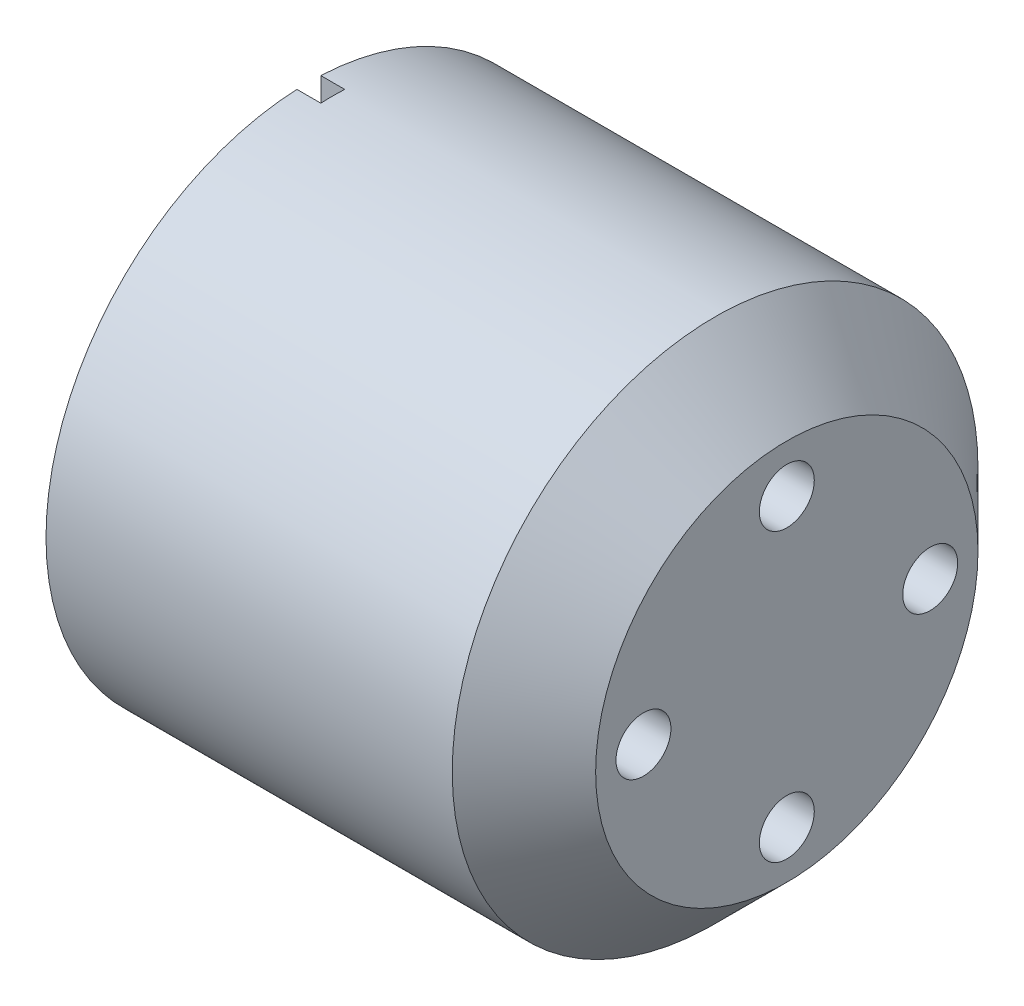
ISO-10303-21;
HEADER;
FILE_DESCRIPTION(('STEP AP214'),'2;1');
FILE_NAME('part.step','',(''),(''),'','','');
FILE_SCHEMA(('AUTOMOTIVE_DESIGN { 1 0 10303 214 1 1 1 1 }'));
ENDSEC;
DATA;
#1=APPLICATION_CONTEXT('core data for automotive mechanical design processes');
#2=APPLICATION_PROTOCOL_DEFINITION('international standard','automotive_design',2000,#1);
#3=PRODUCT_CONTEXT('',#1,'mechanical');
#4=PRODUCT('Part','Part','',(#3));
#5=PRODUCT_RELATED_PRODUCT_CATEGORY('part','',(#4));
#6=PRODUCT_DEFINITION_FORMATION('','',#4);
#7=PRODUCT_DEFINITION_CONTEXT('part definition',#1,'design');
#8=PRODUCT_DEFINITION('design','',#6,#7);
#9=PRODUCT_DEFINITION_SHAPE('','',#8);
#10=(LENGTH_UNIT() NAMED_UNIT(*) SI_UNIT(.MILLI.,.METRE.));
#11=(NAMED_UNIT(*) PLANE_ANGLE_UNIT() SI_UNIT($,.RADIAN.));
#12=(NAMED_UNIT(*) SI_UNIT($,.STERADIAN.) SOLID_ANGLE_UNIT());
#13=UNCERTAINTY_MEASURE_WITH_UNIT(LENGTH_MEASURE(1.E-05),#10,'distance_accuracy_value','');
#14=(GEOMETRIC_REPRESENTATION_CONTEXT(3) GLOBAL_UNCERTAINTY_ASSIGNED_CONTEXT((#13)) GLOBAL_UNIT_ASSIGNED_CONTEXT((#10,
#11,#12)) REPRESENTATION_CONTEXT('',''));
#15=CARTESIAN_POINT('',(0.,0.,0.));
#16=DIRECTION('',(0.,0.,1.));
#17=DIRECTION('',(1.,0.,0.));
#18=AXIS2_PLACEMENT_3D('',#15,#16,#17);
#19=CARTESIAN_POINT('',(20.,0.,0.));
#20=DIRECTION('',(1.,0.,0.));
#21=DIRECTION('',(0.,0.,-1.));
#22=AXIS2_PLACEMENT_3D('',#19,#20,#21);
#23=PLANE('',#22);
#24=CARTESIAN_POINT('',(20.,0.,0.));
#25=DIRECTION('',(1.,0.,0.));
#26=DIRECTION('',(0.,0.,-1.));
#27=AXIS2_PLACEMENT_3D('',#24,#25,#26);
#28=CIRCLE('',#27,7.99999999999999);
#29=CARTESIAN_POINT('',(20.,0.,-7.99999999999999));
#30=VERTEX_POINT('',#29);
#31=EDGE_CURVE('E156',#30,#30,#28,.T.);
#32=ORIENTED_EDGE('',*,*,#31,.T.);
#33=EDGE_LOOP('',(#32));
#34=FACE_BOUND('',#33,.T.);
#35=CARTESIAN_POINT('',(20.,-6.,0.));
#36=DIRECTION('',(1.,0.,0.));
#37=DIRECTION('',(0.,0.,-1.));
#38=AXIS2_PLACEMENT_3D('',#35,#36,#37);
#39=CIRCLE('',#38,1.15);
#40=CARTESIAN_POINT('',(20.,-6.,-1.15));
#41=VERTEX_POINT('',#40);
#42=EDGE_CURVE('E143',#41,#41,#39,.T.);
#43=ORIENTED_EDGE('',*,*,#42,.F.);
#44=EDGE_LOOP('',(#43));
#45=FACE_BOUND('',#44,.T.);
#46=CARTESIAN_POINT('',(20.,6.,0.));
#47=DIRECTION('',(1.,0.,0.));
#48=DIRECTION('',(0.,0.,-1.));
#49=AXIS2_PLACEMENT_3D('',#46,#47,#48);
#50=CIRCLE('',#49,1.15);
#51=CARTESIAN_POINT('',(20.,6.,-1.15));
#52=VERTEX_POINT('',#51);
#53=EDGE_CURVE('E150',#52,#52,#50,.T.);
#54=ORIENTED_EDGE('',*,*,#53,.F.);
#55=EDGE_LOOP('',(#54));
#56=FACE_BOUND('',#55,.T.);
#57=CARTESIAN_POINT('',(20.,0.,6.));
#58=DIRECTION('',(1.,0.,0.));
#59=DIRECTION('',(0.,0.,-1.));
#60=AXIS2_PLACEMENT_3D('',#57,#58,#59);
#61=CIRCLE('',#60,1.15);
#62=CARTESIAN_POINT('',(20.,0.,4.85));
#63=VERTEX_POINT('',#62);
#64=EDGE_CURVE('E147',#63,#63,#61,.T.);
#65=ORIENTED_EDGE('',*,*,#64,.F.);
#66=EDGE_LOOP('',(#65));
#67=FACE_BOUND('',#66,.T.);
#68=CARTESIAN_POINT('',(20.,0.,-6.));
#69=DIRECTION('',(1.,0.,0.));
#70=DIRECTION('',(0.,0.,-1.));
#71=AXIS2_PLACEMENT_3D('',#68,#69,#70);
#72=CIRCLE('',#71,1.15);
#73=CARTESIAN_POINT('',(20.,0.,-7.15));
#74=VERTEX_POINT('',#73);
#75=EDGE_CURVE('E140',#74,#74,#72,.T.);
#76=ORIENTED_EDGE('',*,*,#75,.F.);
#77=EDGE_LOOP('',(#76));
#78=FACE_BOUND('',#77,.T.);
#79=ADVANCED_FACE('F36',(#34,#45,#56,#67,#78),#23,.T.);
#80=CARTESIAN_POINT('',(0.,0.,0.));
#81=DIRECTION('',(1.,0.,0.));
#82=DIRECTION('',(0.,0.,-1.));
#83=AXIS2_PLACEMENT_3D('',#80,#81,#82);
#84=PLANE('',#83);
#85=CARTESIAN_POINT('',(0.,-5.30330085889914,-5.30330085889908));
#86=DIRECTION('',(1.,0.,0.));
#87=DIRECTION('',(0.,0.,-1.));
#88=AXIS2_PLACEMENT_3D('',#85,#86,#87);
#89=CIRCLE('',#88,2.30000000000001);
#90=CARTESIAN_POINT('',(0.,-5.30330085889914,-7.60330085889908));
#91=VERTEX_POINT('',#90);
#92=EDGE_CURVE('E184',#91,#91,#89,.T.);
#93=ORIENTED_EDGE('',*,*,#92,.T.);
#94=EDGE_LOOP('',(#93));
#95=FACE_BOUND('',#94,.T.);
#96=CARTESIAN_POINT('',(0.,-5.30330085889907,5.30330085889914));
#97=DIRECTION('',(1.,0.,0.));
#98=DIRECTION('',(0.,0.,-1.));
#99=AXIS2_PLACEMENT_3D('',#96,#97,#98);
#100=CIRCLE('',#99,2.30000000000001);
#101=CARTESIAN_POINT('',(0.,-5.30330085889907,3.00330085889913));
#102=VERTEX_POINT('',#101);
#103=EDGE_CURVE('E181',#102,#102,#100,.T.);
#104=ORIENTED_EDGE('',*,*,#103,.T.);
#105=EDGE_LOOP('',(#104));
#106=FACE_BOUND('',#105,.T.);
#107=CARTESIAN_POINT('',(0.,5.30330085889914,5.30330085889908));
#108=DIRECTION('',(1.,0.,0.));
#109=DIRECTION('',(0.,0.,-1.));
#110=AXIS2_PLACEMENT_3D('',#107,#108,#109);
#111=CIRCLE('',#110,2.30000000000001);
#112=CARTESIAN_POINT('',(0.,5.30330085889914,3.00330085889907));
#113=VERTEX_POINT('',#112);
#114=EDGE_CURVE('E178',#113,#113,#111,.T.);
#115=ORIENTED_EDGE('',*,*,#114,.T.);
#116=EDGE_LOOP('',(#115));
#117=FACE_BOUND('',#116,.T.);
#118=CARTESIAN_POINT('',(0.,5.30330085889908,-5.30330085889914));
#119=DIRECTION('',(1.,0.,0.));
#120=DIRECTION('',(0.,0.,-1.));
#121=AXIS2_PLACEMENT_3D('',#118,#119,#120);
#122=CIRCLE('',#121,2.30000000000001);
#123=CARTESIAN_POINT('',(0.,5.30330085889908,-7.60330085889914));
#124=VERTEX_POINT('',#123);
#125=EDGE_CURVE('E175',#124,#124,#122,.T.);
#126=ORIENTED_EDGE('',*,*,#125,.T.);
#127=EDGE_LOOP('',(#126));
#128=FACE_BOUND('',#127,.T.);
#129=CARTESIAN_POINT('',(0.,0.,-6.));
#130=DIRECTION('',(-1.,0.,0.));
#131=DIRECTION('',(0.,0.,1.));
#132=AXIS2_PLACEMENT_3D('',#129,#130,#131);
#133=CIRCLE('',#132,2.);
#134=CARTESIAN_POINT('',(0.,0.,-4.));
#135=VERTEX_POINT('',#134);
#136=EDGE_CURVE('E116',#135,#135,#133,.T.);
#137=ORIENTED_EDGE('',*,*,#136,.F.);
#138=EDGE_LOOP('',(#137));
#139=FACE_BOUND('',#138,.T.);
#140=CARTESIAN_POINT('',(0.,6.,0.));
#141=DIRECTION('',(-1.,0.,0.));
#142=DIRECTION('',(0.,0.,1.));
#143=AXIS2_PLACEMENT_3D('',#140,#141,#142);
#144=CIRCLE('',#143,2.);
#145=CARTESIAN_POINT('',(0.,6.,2.));
#146=VERTEX_POINT('',#145);
#147=EDGE_CURVE('E124',#146,#146,#144,.T.);
#148=ORIENTED_EDGE('',*,*,#147,.F.);
#149=EDGE_LOOP('',(#148));
#150=FACE_BOUND('',#149,.T.);
#151=CARTESIAN_POINT('',(0.,-6.,0.));
#152=DIRECTION('',(-1.,0.,0.));
#153=DIRECTION('',(0.,0.,1.));
#154=AXIS2_PLACEMENT_3D('',#151,#152,#153);
#155=CIRCLE('',#154,2.);
#156=CARTESIAN_POINT('',(0.,-6.,2.));
#157=VERTEX_POINT('',#156);
#158=EDGE_CURVE('E130',#157,#157,#155,.T.);
#159=ORIENTED_EDGE('',*,*,#158,.F.);
#160=EDGE_LOOP('',(#159));
#161=FACE_BOUND('',#160,.T.);
#162=CARTESIAN_POINT('',(0.,0.,6.));
#163=DIRECTION('',(-1.,0.,0.));
#164=DIRECTION('',(0.,0.,1.));
#165=AXIS2_PLACEMENT_3D('',#162,#163,#164);
#166=CIRCLE('',#165,2.);
#167=CARTESIAN_POINT('',(0.,0.,8.));
#168=VERTEX_POINT('',#167);
#169=EDGE_CURVE('E115',#168,#168,#166,.T.);
#170=ORIENTED_EDGE('',*,*,#169,.F.);
#171=EDGE_LOOP('',(#170));
#172=FACE_BOUND('',#171,.T.);
#173=CARTESIAN_POINT('',(0.,0.,0.));
#174=DIRECTION('',(1.,0.,0.));
#175=DIRECTION('',(0.,0.,-1.));
#176=AXIS2_PLACEMENT_3D('',#173,#174,#175);
#177=CIRCLE('',#176,11.);
#178=CARTESIAN_POINT('',(0.,10.988630487918,0.5));
#179=VERTEX_POINT('',#178);
#180=CARTESIAN_POINT('',(0.,10.988630487918,-0.499999999999999));
#181=VERTEX_POINT('',#180);
#182=EDGE_CURVE('E153',#179,#181,#177,.T.);
#183=ORIENTED_EDGE('',*,*,#182,.F.);
#184=DIRECTION('',(0.,1.,0.));
#185=VECTOR('',#184,1.);
#186=CARTESIAN_POINT('',(0.,12.5,0.5));
#187=LINE('',#186,#185);
#188=CARTESIAN_POINT('',(0.,9.5,0.5));
#189=VERTEX_POINT('',#188);
#190=EDGE_CURVE('E97',#189,#179,#187,.T.);
#191=ORIENTED_EDGE('',*,*,#190,.F.);
#192=DIRECTION('',(0.,0.,1.));
#193=VECTOR('',#192,1.);
#194=CARTESIAN_POINT('',(0.,9.5,-0.5));
#195=LINE('',#194,#193);
#196=CARTESIAN_POINT('',(0.,9.5,-0.5));
#197=VERTEX_POINT('',#196);
#198=EDGE_CURVE('E100',#197,#189,#195,.T.);
#199=ORIENTED_EDGE('',*,*,#198,.F.);
#200=DIRECTION('',(0.,-1.,0.));
#201=VECTOR('',#200,1.);
#202=CARTESIAN_POINT('',(0.,12.5,-0.499999999999999));
#203=LINE('',#202,#201);
#204=EDGE_CURVE('E87',#181,#197,#203,.T.);
#205=ORIENTED_EDGE('',*,*,#204,.F.);
#206=EDGE_LOOP('',(#183,#191,#199,#205));
#207=FACE_BOUND('',#206,.T.);
#208=ADVANCED_FACE('F200',(#95,#106,#117,#128,#139,#150,#161,#172,#207),#84,.F.);
#209=CARTESIAN_POINT('',(20.,0.,0.));
#210=DIRECTION('',(-1.,0.,0.));
#211=DIRECTION('',(0.,0.,1.));
#212=AXIS2_PLACEMENT_3D('',#209,#210,#211);
#213=CYLINDRICAL_SURFACE('',#212,11.);
#214=CARTESIAN_POINT('',(17.,0.,0.));
#215=DIRECTION('',(1.,0.,0.));
#216=DIRECTION('',(0.,0.,-1.));
#217=AXIS2_PLACEMENT_3D('',#214,#215,#216);
#218=CIRCLE('',#217,11.);
#219=CARTESIAN_POINT('',(17.,0.,-11.));
#220=VERTEX_POINT('',#219);
#221=EDGE_CURVE('E159',#220,#220,#218,.F.);
#222=ORIENTED_EDGE('',*,*,#221,.T.);
#223=EDGE_LOOP('',(#222));
#224=FACE_BOUND('',#223,.T.);
#225=CARTESIAN_POINT('',(1.,0.,0.));
#226=DIRECTION('',(-1.,0.,0.));
#227=DIRECTION('',(0.,0.,1.));
#228=AXIS2_PLACEMENT_3D('',#225,#226,#227);
#229=CIRCLE('',#228,11.);
#230=CARTESIAN_POINT('',(1.,10.988630487918,0.5));
#231=VERTEX_POINT('',#230);
#232=CARTESIAN_POINT('',(1.,10.988630487918,-0.499999999999999));
#233=VERTEX_POINT('',#232);
#234=EDGE_CURVE('E57',#231,#233,#229,.T.);
#235=ORIENTED_EDGE('',*,*,#234,.F.);
#236=DIRECTION('',(-1.,0.,0.));
#237=VECTOR('',#236,1.);
#238=CARTESIAN_POINT('',(20.,10.988630487918,0.5));
#239=LINE('',#238,#237);
#240=EDGE_CURVE('E12',#231,#179,#239,.T.);
#241=ORIENTED_EDGE('',*,*,#240,.T.);
#242=ORIENTED_EDGE('',*,*,#182,.T.);
#243=DIRECTION('',(-1.,0.,0.));
#244=VECTOR('',#243,1.);
#245=CARTESIAN_POINT('',(20.,10.988630487918,-0.499999999999999));
#246=LINE('',#245,#244);
#247=EDGE_CURVE('E45',#181,#233,#246,.F.);
#248=ORIENTED_EDGE('',*,*,#247,.T.);
#249=EDGE_LOOP('',(#235,#241,#242,#248));
#250=FACE_BOUND('',#249,.T.);
#251=ADVANCED_FACE('F197',(#224,#250),#213,.T.);
#252=CARTESIAN_POINT('',(20.,6.,0.));
#253=DIRECTION('',(-1.,0.,0.));
#254=DIRECTION('',(0.,0.,1.));
#255=AXIS2_PLACEMENT_3D('',#252,#253,#254);
#256=CYLINDRICAL_SURFACE('',#255,1.15);
#257=CARTESIAN_POINT('',(14.5,6.,0.));
#258=DIRECTION('',(1.,0.,0.));
#259=DIRECTION('',(0.,0.,-1.));
#260=AXIS2_PLACEMENT_3D('',#257,#258,#259);
#261=CIRCLE('',#260,1.15);
#262=CARTESIAN_POINT('',(14.5,6.,-1.15));
#263=VERTEX_POINT('',#262);
#264=EDGE_CURVE('E144',#263,#263,#261,.T.);
#265=ORIENTED_EDGE('',*,*,#264,.F.);
#266=EDGE_LOOP('',(#265));
#267=FACE_BOUND('',#266,.T.);
#268=ORIENTED_EDGE('',*,*,#53,.T.);
#269=EDGE_LOOP('',(#268));
#270=FACE_BOUND('',#269,.T.);
#271=ADVANCED_FACE('F224',(#267,#270),#256,.F.);
#272=CARTESIAN_POINT('',(20.,0.,6.));
#273=DIRECTION('',(-1.,0.,0.));
#274=DIRECTION('',(0.,0.,1.));
#275=AXIS2_PLACEMENT_3D('',#272,#273,#274);
#276=CYLINDRICAL_SURFACE('',#275,1.15);
#277=CARTESIAN_POINT('',(14.5,0.,6.));
#278=DIRECTION('',(1.,0.,0.));
#279=DIRECTION('',(0.,0.,-1.));
#280=AXIS2_PLACEMENT_3D('',#277,#278,#279);
#281=CIRCLE('',#280,1.15);
#282=CARTESIAN_POINT('',(14.5,0.,4.85));
#283=VERTEX_POINT('',#282);
#284=EDGE_CURVE('E168',#283,#283,#281,.T.);
#285=ORIENTED_EDGE('',*,*,#284,.F.);
#286=EDGE_LOOP('',(#285));
#287=FACE_BOUND('',#286,.T.);
#288=ORIENTED_EDGE('',*,*,#64,.T.);
#289=EDGE_LOOP('',(#288));
#290=FACE_BOUND('',#289,.T.);
#291=ADVANCED_FACE('F320',(#287,#290),#276,.F.);
#292=CARTESIAN_POINT('',(20.,-6.,0.));
#293=DIRECTION('',(-1.,0.,0.));
#294=DIRECTION('',(0.,0.,1.));
#295=AXIS2_PLACEMENT_3D('',#292,#293,#294);
#296=CYLINDRICAL_SURFACE('',#295,1.15);
#297=CARTESIAN_POINT('',(14.5,-6.,0.));
#298=DIRECTION('',(1.,0.,0.));
#299=DIRECTION('',(0.,0.,-1.));
#300=AXIS2_PLACEMENT_3D('',#297,#298,#299);
#301=CIRCLE('',#300,1.15);
#302=CARTESIAN_POINT('',(14.5,-6.,-1.15));
#303=VERTEX_POINT('',#302);
#304=EDGE_CURVE('E165',#303,#303,#301,.T.);
#305=ORIENTED_EDGE('',*,*,#304,.F.);
#306=EDGE_LOOP('',(#305));
#307=FACE_BOUND('',#306,.T.);
#308=ORIENTED_EDGE('',*,*,#42,.T.);
#309=EDGE_LOOP('',(#308));
#310=FACE_BOUND('',#309,.T.);
#311=ADVANCED_FACE('F317',(#307,#310),#296,.F.);
#312=CARTESIAN_POINT('',(20.,0.,-6.));
#313=DIRECTION('',(-1.,0.,0.));
#314=DIRECTION('',(0.,0.,1.));
#315=AXIS2_PLACEMENT_3D('',#312,#313,#314);
#316=CYLINDRICAL_SURFACE('',#315,1.15);
#317=CARTESIAN_POINT('',(14.5,0.,-6.));
#318=DIRECTION('',(1.,0.,0.));
#319=DIRECTION('',(0.,0.,-1.));
#320=AXIS2_PLACEMENT_3D('',#317,#318,#319);
#321=CIRCLE('',#320,1.15);
#322=CARTESIAN_POINT('',(14.5,0.,-7.15));
#323=VERTEX_POINT('',#322);
#324=EDGE_CURVE('E123',#323,#323,#321,.T.);
#325=ORIENTED_EDGE('',*,*,#324,.F.);
#326=EDGE_LOOP('',(#325));
#327=FACE_BOUND('',#326,.T.);
#328=ORIENTED_EDGE('',*,*,#75,.T.);
#329=EDGE_LOOP('',(#328));
#330=FACE_BOUND('',#329,.T.);
#331=ADVANCED_FACE('F238',(#327,#330),#316,.F.);
#332=CARTESIAN_POINT('',(20.,0.,0.));
#333=DIRECTION('',(-1.,0.,0.));
#334=DIRECTION('',(0.,0.,1.));
#335=AXIS2_PLACEMENT_3D('',#332,#333,#334);
#336=CONICAL_SURFACE('',#335,7.99999999999999,0.785398163397448);
#337=ORIENTED_EDGE('',*,*,#221,.F.);
#338=EDGE_LOOP('',(#337));
#339=FACE_BOUND('',#338,.T.);
#340=ORIENTED_EDGE('',*,*,#31,.F.);
#341=EDGE_LOOP('',(#340));
#342=FACE_BOUND('',#341,.T.);
#343=ADVANCED_FACE('F231',(#339,#342),#336,.T.);
#344=CARTESIAN_POINT('',(14.5,0.,0.));
#345=DIRECTION('',(1.,0.,0.));
#346=DIRECTION('',(0.,0.,-1.));
#347=AXIS2_PLACEMENT_3D('',#344,#345,#346);
#348=PLANE('',#347);
#349=ORIENTED_EDGE('',*,*,#324,.T.);
#350=EDGE_LOOP('',(#349));
#351=FACE_BOUND('',#350,.T.);
#352=CARTESIAN_POINT('',(14.5,0.,-6.));
#353=DIRECTION('',(1.,0.,0.));
#354=DIRECTION('',(0.,0.,-1.));
#355=AXIS2_PLACEMENT_3D('',#352,#353,#354);
#356=CIRCLE('',#355,2.);
#357=CARTESIAN_POINT('',(14.5,0.,-8.));
#358=VERTEX_POINT('',#357);
#359=EDGE_CURVE('E119',#358,#358,#356,.F.);
#360=ORIENTED_EDGE('',*,*,#359,.T.);
#361=EDGE_LOOP('',(#360));
#362=FACE_BOUND('',#361,.T.);
#363=ADVANCED_FACE('F237',(#351,#362),#348,.F.);
#364=CARTESIAN_POINT('',(25.6568542494924,0.,-6.));
#365=DIRECTION('',(-1.,0.,0.));
#366=DIRECTION('',(0.,0.,1.));
#367=AXIS2_PLACEMENT_3D('',#364,#365,#366);
#368=CYLINDRICAL_SURFACE('',#367,2.);
#369=ORIENTED_EDGE('',*,*,#136,.T.);
#370=EDGE_LOOP('',(#369));
#371=FACE_BOUND('',#370,.T.);
#372=ORIENTED_EDGE('',*,*,#359,.F.);
#373=EDGE_LOOP('',(#372));
#374=FACE_BOUND('',#373,.T.);
#375=ADVANCED_FACE('F285',(#371,#374),#368,.F.);
#376=CARTESIAN_POINT('',(14.5,0.,0.));
#377=DIRECTION('',(1.,0.,0.));
#378=DIRECTION('',(0.,0.,-1.));
#379=AXIS2_PLACEMENT_3D('',#376,#377,#378);
#380=PLANE('',#379);
#381=ORIENTED_EDGE('',*,*,#304,.T.);
#382=EDGE_LOOP('',(#381));
#383=FACE_BOUND('',#382,.T.);
#384=CARTESIAN_POINT('',(14.5,-6.,0.));
#385=DIRECTION('',(1.,0.,0.));
#386=DIRECTION('',(0.,0.,-1.));
#387=AXIS2_PLACEMENT_3D('',#384,#385,#386);
#388=CIRCLE('',#387,2.);
#389=CARTESIAN_POINT('',(14.5,-6.,-2.));
#390=VERTEX_POINT('',#389);
#391=EDGE_CURVE('E127',#390,#390,#388,.F.);
#392=ORIENTED_EDGE('',*,*,#391,.T.);
#393=EDGE_LOOP('',(#392));
#394=FACE_BOUND('',#393,.T.);
#395=ADVANCED_FACE('F288',(#383,#394),#380,.F.);
#396=CARTESIAN_POINT('',(25.6568542494924,-6.,0.));
#397=DIRECTION('',(-1.,0.,0.));
#398=DIRECTION('',(0.,0.,1.));
#399=AXIS2_PLACEMENT_3D('',#396,#397,#398);
#400=CYLINDRICAL_SURFACE('',#399,2.);
#401=ORIENTED_EDGE('',*,*,#158,.T.);
#402=EDGE_LOOP('',(#401));
#403=FACE_BOUND('',#402,.T.);
#404=ORIENTED_EDGE('',*,*,#391,.F.);
#405=EDGE_LOOP('',(#404));
#406=FACE_BOUND('',#405,.T.);
#407=ADVANCED_FACE('F301',(#403,#406),#400,.F.);
#408=CARTESIAN_POINT('',(14.5,0.,0.));
#409=DIRECTION('',(1.,0.,0.));
#410=DIRECTION('',(0.,0.,-1.));
#411=AXIS2_PLACEMENT_3D('',#408,#409,#410);
#412=PLANE('',#411);
#413=ORIENTED_EDGE('',*,*,#284,.T.);
#414=EDGE_LOOP('',(#413));
#415=FACE_BOUND('',#414,.T.);
#416=CARTESIAN_POINT('',(14.5,0.,6.));
#417=DIRECTION('',(1.,0.,0.));
#418=DIRECTION('',(0.,0.,-1.));
#419=AXIS2_PLACEMENT_3D('',#416,#417,#418);
#420=CIRCLE('',#419,2.);
#421=CARTESIAN_POINT('',(14.5,0.,4.));
#422=VERTEX_POINT('',#421);
#423=EDGE_CURVE('E133',#422,#422,#420,.F.);
#424=ORIENTED_EDGE('',*,*,#423,.T.);
#425=EDGE_LOOP('',(#424));
#426=FACE_BOUND('',#425,.T.);
#427=ADVANCED_FACE('F304',(#415,#426),#412,.F.);
#428=CARTESIAN_POINT('',(25.6568542494924,0.,6.));
#429=DIRECTION('',(-1.,0.,0.));
#430=DIRECTION('',(0.,0.,1.));
#431=AXIS2_PLACEMENT_3D('',#428,#429,#430);
#432=CYLINDRICAL_SURFACE('',#431,2.);
#433=ORIENTED_EDGE('',*,*,#169,.T.);
#434=EDGE_LOOP('',(#433));
#435=FACE_BOUND('',#434,.T.);
#436=ORIENTED_EDGE('',*,*,#423,.F.);
#437=EDGE_LOOP('',(#436));
#438=FACE_BOUND('',#437,.T.);
#439=ADVANCED_FACE('F299',(#435,#438),#432,.F.);
#440=CARTESIAN_POINT('',(14.5,0.,0.));
#441=DIRECTION('',(1.,0.,0.));
#442=DIRECTION('',(0.,0.,-1.));
#443=AXIS2_PLACEMENT_3D('',#440,#441,#442);
#444=PLANE('',#443);
#445=ORIENTED_EDGE('',*,*,#264,.T.);
#446=EDGE_LOOP('',(#445));
#447=FACE_BOUND('',#446,.T.);
#448=CARTESIAN_POINT('',(14.5,6.,0.));
#449=DIRECTION('',(1.,0.,0.));
#450=DIRECTION('',(0.,0.,-1.));
#451=AXIS2_PLACEMENT_3D('',#448,#449,#450);
#452=CIRCLE('',#451,2.);
#453=CARTESIAN_POINT('',(14.5,6.,-2.));
#454=VERTEX_POINT('',#453);
#455=EDGE_CURVE('E120',#454,#454,#452,.F.);
#456=ORIENTED_EDGE('',*,*,#455,.T.);
#457=EDGE_LOOP('',(#456));
#458=FACE_BOUND('',#457,.T.);
#459=ADVANCED_FACE('F295',(#447,#458),#444,.F.);
#460=CARTESIAN_POINT('',(25.6568542494924,6.,0.));
#461=DIRECTION('',(-1.,0.,0.));
#462=DIRECTION('',(0.,0.,1.));
#463=AXIS2_PLACEMENT_3D('',#460,#461,#462);
#464=CYLINDRICAL_SURFACE('',#463,2.);
#465=ORIENTED_EDGE('',*,*,#147,.T.);
#466=EDGE_LOOP('',(#465));
#467=FACE_BOUND('',#466,.T.);
#468=ORIENTED_EDGE('',*,*,#455,.F.);
#469=EDGE_LOOP('',(#468));
#470=FACE_BOUND('',#469,.T.);
#471=ADVANCED_FACE('F268',(#467,#470),#464,.F.);
#472=CARTESIAN_POINT('',(8.,5.30330085889914,5.30330085889908));
#473=DIRECTION('',(-1.,0.,0.));
#474=DIRECTION('',(0.,0.,1.));
#475=AXIS2_PLACEMENT_3D('',#472,#473,#474);
#476=CYLINDRICAL_SURFACE('',#475,2.);
#477=CARTESIAN_POINT('',(1.20000000000003,5.30330085889914,5.30330085889908));
#478=DIRECTION('',(1.,0.,0.));
#479=DIRECTION('',(0.,0.,-1.));
#480=AXIS2_PLACEMENT_3D('',#477,#478,#479);
#481=CIRCLE('',#480,2.);
#482=CARTESIAN_POINT('',(1.20000000000003,5.30330085889914,3.30330085889907));
#483=VERTEX_POINT('',#482);
#484=EDGE_CURVE('E190',#483,#483,#481,.F.);
#485=ORIENTED_EDGE('',*,*,#484,.T.);
#486=EDGE_LOOP('',(#485));
#487=FACE_BOUND('',#486,.T.);
#488=CARTESIAN_POINT('',(8.,5.30330085889914,5.30330085889908));
#489=DIRECTION('',(-1.,0.,0.));
#490=DIRECTION('',(0.,0.,1.));
#491=AXIS2_PLACEMENT_3D('',#488,#489,#490);
#492=CIRCLE('',#491,2.);
#493=CARTESIAN_POINT('',(8.,5.30330085889914,7.30330085889908));
#494=VERTEX_POINT('',#493);
#495=EDGE_CURVE('E107',#494,#494,#492,.T.);
#496=ORIENTED_EDGE('',*,*,#495,.F.);
#497=EDGE_LOOP('',(#496));
#498=FACE_BOUND('',#497,.T.);
#499=ADVANCED_FACE('F264',(#487,#498),#476,.F.);
#500=CARTESIAN_POINT('',(8.,5.30330085889914,5.30330085889908));
#501=DIRECTION('',(-1.,0.,0.));
#502=DIRECTION('',(0.,0.,1.));
#503=AXIS2_PLACEMENT_3D('',#500,#501,#502);
#504=PLANE('',#503);
#505=ORIENTED_EDGE('',*,*,#495,.T.);
#506=EDGE_LOOP('',(#505));
#507=FACE_BOUND('',#506,.T.);
#508=ADVANCED_FACE('F267',(#507),#504,.T.);
#509=CARTESIAN_POINT('',(8.,5.30330085889908,-5.30330085889914));
#510=DIRECTION('',(-1.,0.,0.));
#511=DIRECTION('',(0.,0.,1.));
#512=AXIS2_PLACEMENT_3D('',#509,#510,#511);
#513=CYLINDRICAL_SURFACE('',#512,2.);
#514=CARTESIAN_POINT('',(1.20000000000003,5.30330085889908,-5.30330085889914));
#515=DIRECTION('',(1.,0.,0.));
#516=DIRECTION('',(0.,0.,-1.));
#517=AXIS2_PLACEMENT_3D('',#514,#515,#516);
#518=CIRCLE('',#517,2.);
#519=CARTESIAN_POINT('',(1.20000000000003,5.30330085889908,-7.30330085889914));
#520=VERTEX_POINT('',#519);
#521=EDGE_CURVE('E193',#520,#520,#518,.F.);
#522=ORIENTED_EDGE('',*,*,#521,.T.);
#523=EDGE_LOOP('',(#522));
#524=FACE_BOUND('',#523,.T.);
#525=CARTESIAN_POINT('',(8.,5.30330085889908,-5.30330085889914));
#526=DIRECTION('',(-1.,0.,0.));
#527=DIRECTION('',(0.,0.,1.));
#528=AXIS2_PLACEMENT_3D('',#525,#526,#527);
#529=CIRCLE('',#528,2.);
#530=CARTESIAN_POINT('',(8.,5.30330085889908,-3.30330085889913));
#531=VERTEX_POINT('',#530);
#532=EDGE_CURVE('E104',#531,#531,#529,.T.);
#533=ORIENTED_EDGE('',*,*,#532,.F.);
#534=EDGE_LOOP('',(#533));
#535=FACE_BOUND('',#534,.T.);
#536=ADVANCED_FACE('F273',(#524,#535),#513,.F.);
#537=CARTESIAN_POINT('',(8.,5.30330085889908,-5.30330085889914));
#538=DIRECTION('',(-1.,0.,0.));
#539=DIRECTION('',(0.,0.,1.));
#540=AXIS2_PLACEMENT_3D('',#537,#538,#539);
#541=PLANE('',#540);
#542=ORIENTED_EDGE('',*,*,#532,.T.);
#543=EDGE_LOOP('',(#542));
#544=FACE_BOUND('',#543,.T.);
#545=ADVANCED_FACE('F278',(#544),#541,.T.);
#546=CARTESIAN_POINT('',(8.,-5.30330085889914,-5.30330085889908));
#547=DIRECTION('',(-1.,0.,0.));
#548=DIRECTION('',(0.,0.,1.));
#549=AXIS2_PLACEMENT_3D('',#546,#547,#548);
#550=CYLINDRICAL_SURFACE('',#549,2.);
#551=CARTESIAN_POINT('',(1.20000000000005,-5.30330085889914,-5.30330085889908));
#552=DIRECTION('',(1.,0.,0.));
#553=DIRECTION('',(0.,0.,-1.));
#554=AXIS2_PLACEMENT_3D('',#551,#552,#553);
#555=CIRCLE('',#554,2.);
#556=CARTESIAN_POINT('',(1.20000000000005,-5.30330085889914,-7.30330085889907));
#557=VERTEX_POINT('',#556);
#558=EDGE_CURVE('E162',#557,#557,#555,.F.);
#559=ORIENTED_EDGE('',*,*,#558,.T.);
#560=EDGE_LOOP('',(#559));
#561=FACE_BOUND('',#560,.T.);
#562=CARTESIAN_POINT('',(8.,-5.30330085889914,-5.30330085889908));
#563=DIRECTION('',(-1.,0.,0.));
#564=DIRECTION('',(0.,0.,1.));
#565=AXIS2_PLACEMENT_3D('',#562,#563,#564);
#566=CIRCLE('',#565,2.);
#567=CARTESIAN_POINT('',(8.,-5.30330085889914,-3.30330085889908));
#568=VERTEX_POINT('',#567);
#569=EDGE_CURVE('E108',#568,#568,#566,.T.);
#570=ORIENTED_EDGE('',*,*,#569,.F.);
#571=EDGE_LOOP('',(#570));
#572=FACE_BOUND('',#571,.T.);
#573=ADVANCED_FACE('F398',(#561,#572),#550,.F.);
#574=CARTESIAN_POINT('',(8.,-5.30330085889914,-5.30330085889908));
#575=DIRECTION('',(-1.,0.,0.));
#576=DIRECTION('',(0.,0.,1.));
#577=AXIS2_PLACEMENT_3D('',#574,#575,#576);
#578=PLANE('',#577);
#579=ORIENTED_EDGE('',*,*,#569,.T.);
#580=EDGE_LOOP('',(#579));
#581=FACE_BOUND('',#580,.T.);
#582=ADVANCED_FACE('F391',(#581),#578,.T.);
#583=CARTESIAN_POINT('',(8.,-5.30330085889907,5.30330085889914));
#584=DIRECTION('',(-1.,0.,0.));
#585=DIRECTION('',(0.,0.,1.));
#586=AXIS2_PLACEMENT_3D('',#583,#584,#585);
#587=CYLINDRICAL_SURFACE('',#586,2.);
#588=CARTESIAN_POINT('',(1.20000000000005,-5.30330085889907,5.30330085889914));
#589=DIRECTION('',(1.,0.,0.));
#590=DIRECTION('',(0.,0.,-1.));
#591=AXIS2_PLACEMENT_3D('',#588,#589,#590);
#592=CIRCLE('',#591,2.);
#593=CARTESIAN_POINT('',(1.20000000000005,-5.30330085889907,3.30330085889914));
#594=VERTEX_POINT('',#593);
#595=EDGE_CURVE('E187',#594,#594,#592,.F.);
#596=ORIENTED_EDGE('',*,*,#595,.T.);
#597=EDGE_LOOP('',(#596));
#598=FACE_BOUND('',#597,.T.);
#599=CARTESIAN_POINT('',(8.,-5.30330085889907,5.30330085889914));
#600=DIRECTION('',(-1.,0.,0.));
#601=DIRECTION('',(0.,0.,1.));
#602=AXIS2_PLACEMENT_3D('',#599,#600,#601);
#603=CIRCLE('',#602,2.);
#604=CARTESIAN_POINT('',(8.,-5.30330085889907,7.30330085889914));
#605=VERTEX_POINT('',#604);
#606=EDGE_CURVE('E102',#605,#605,#603,.T.);
#607=ORIENTED_EDGE('',*,*,#606,.F.);
#608=EDGE_LOOP('',(#607));
#609=FACE_BOUND('',#608,.T.);
#610=ADVANCED_FACE('F282',(#598,#609),#587,.F.);
#611=CARTESIAN_POINT('',(8.,-5.30330085889907,5.30330085889914));
#612=DIRECTION('',(-1.,0.,0.));
#613=DIRECTION('',(0.,0.,1.));
#614=AXIS2_PLACEMENT_3D('',#611,#612,#613);
#615=PLANE('',#614);
#616=ORIENTED_EDGE('',*,*,#606,.T.);
#617=EDGE_LOOP('',(#616));
#618=FACE_BOUND('',#617,.T.);
#619=ADVANCED_FACE('F247',(#618),#615,.T.);
#620=CARTESIAN_POINT('',(1.20000000000005,-5.30330085889914,-5.30330085889908));
#621=DIRECTION('',(-1.,0.,0.));
#622=DIRECTION('',(0.,0.,1.));
#623=AXIS2_PLACEMENT_3D('',#620,#621,#622);
#624=CONICAL_SURFACE('',#623,2.,0.244978663126861);
#625=ORIENTED_EDGE('',*,*,#92,.F.);
#626=EDGE_LOOP('',(#625));
#627=FACE_BOUND('',#626,.T.);
#628=ORIENTED_EDGE('',*,*,#558,.F.);
#629=EDGE_LOOP('',(#628));
#630=FACE_BOUND('',#629,.T.);
#631=ADVANCED_FACE('F240',(#627,#630),#624,.F.);
#632=CARTESIAN_POINT('',(1.20000000000005,-5.30330085889907,5.30330085889914));
#633=DIRECTION('',(-1.,0.,0.));
#634=DIRECTION('',(0.,0.,1.));
#635=AXIS2_PLACEMENT_3D('',#632,#633,#634);
#636=CONICAL_SURFACE('',#635,2.,0.244978663126861);
#637=ORIENTED_EDGE('',*,*,#103,.F.);
#638=EDGE_LOOP('',(#637));
#639=FACE_BOUND('',#638,.T.);
#640=ORIENTED_EDGE('',*,*,#595,.F.);
#641=EDGE_LOOP('',(#640));
#642=FACE_BOUND('',#641,.T.);
#643=ADVANCED_FACE('F246',(#639,#642),#636,.F.);
#644=CARTESIAN_POINT('',(1.20000000000003,5.30330085889914,5.30330085889908));
#645=DIRECTION('',(-1.,0.,0.));
#646=DIRECTION('',(0.,0.,1.));
#647=AXIS2_PLACEMENT_3D('',#644,#645,#646);
#648=CONICAL_SURFACE('',#647,2.,0.244978663126861);
#649=ORIENTED_EDGE('',*,*,#114,.F.);
#650=EDGE_LOOP('',(#649));
#651=FACE_BOUND('',#650,.T.);
#652=ORIENTED_EDGE('',*,*,#484,.F.);
#653=EDGE_LOOP('',(#652));
#654=FACE_BOUND('',#653,.T.);
#655=ADVANCED_FACE('F211',(#651,#654),#648,.F.);
#656=CARTESIAN_POINT('',(1.20000000000003,5.30330085889908,-5.30330085889914));
#657=DIRECTION('',(-1.,0.,0.));
#658=DIRECTION('',(0.,0.,1.));
#659=AXIS2_PLACEMENT_3D('',#656,#657,#658);
#660=CONICAL_SURFACE('',#659,2.,0.244978663126861);
#661=ORIENTED_EDGE('',*,*,#125,.F.);
#662=EDGE_LOOP('',(#661));
#663=FACE_BOUND('',#662,.T.);
#664=ORIENTED_EDGE('',*,*,#521,.F.);
#665=EDGE_LOOP('',(#664));
#666=FACE_BOUND('',#665,.T.);
#667=ADVANCED_FACE('F39',(#663,#666),#660,.F.);
#668=CARTESIAN_POINT('',(1.,12.5,0.5));
#669=DIRECTION('',(0.,0.,1.));
#670=DIRECTION('',(1.,0.,0.));
#671=AXIS2_PLACEMENT_3D('',#668,#669,#670);
#672=PLANE('',#671);
#673=DIRECTION('',(0.,1.,0.));
#674=VECTOR('',#673,1.);
#675=CARTESIAN_POINT('',(1.,12.5,0.5));
#676=LINE('',#675,#674);
#677=CARTESIAN_POINT('',(1.,9.5,0.5));
#678=VERTEX_POINT('',#677);
#679=EDGE_CURVE('E52',#678,#231,#676,.T.);
#680=ORIENTED_EDGE('',*,*,#679,.F.);
#681=DIRECTION('',(-1.,0.,0.));
#682=VECTOR('',#681,1.);
#683=CARTESIAN_POINT('',(1.,9.5,0.5));
#684=LINE('',#683,#682);
#685=EDGE_CURVE('E91',#678,#189,#684,.T.);
#686=ORIENTED_EDGE('',*,*,#685,.T.);
#687=ORIENTED_EDGE('',*,*,#190,.T.);
#688=ORIENTED_EDGE('',*,*,#240,.F.);
#689=EDGE_LOOP('',(#680,#686,#687,#688));
#690=FACE_BOUND('',#689,.T.);
#691=ADVANCED_FACE('F203',(#690),#672,.F.);
#692=CARTESIAN_POINT('',(1.,12.5,-0.499999999999999));
#693=DIRECTION('',(0.,0.,-1.));
#694=DIRECTION('',(0.,1.,0.));
#695=AXIS2_PLACEMENT_3D('',#692,#693,#694);
#696=PLANE('',#695);
#697=ORIENTED_EDGE('',*,*,#204,.T.);
#698=DIRECTION('',(-1.,0.,0.));
#699=VECTOR('',#698,1.);
#700=CARTESIAN_POINT('',(1.,9.5,-0.5));
#701=LINE('',#700,#699);
#702=CARTESIAN_POINT('',(1.,9.5,-0.5));
#703=VERTEX_POINT('',#702);
#704=EDGE_CURVE('E84',#703,#197,#701,.T.);
#705=ORIENTED_EDGE('',*,*,#704,.F.);
#706=DIRECTION('',(0.,-1.,0.));
#707=VECTOR('',#706,1.);
#708=CARTESIAN_POINT('',(1.,12.5,-0.499999999999999));
#709=LINE('',#708,#707);
#710=EDGE_CURVE('E75',#233,#703,#709,.T.);
#711=ORIENTED_EDGE('',*,*,#710,.F.);
#712=ORIENTED_EDGE('',*,*,#247,.F.);
#713=EDGE_LOOP('',(#697,#705,#711,#712));
#714=FACE_BOUND('',#713,.T.);
#715=ADVANCED_FACE('F85',(#714),#696,.F.);
#716=CARTESIAN_POINT('',(1.,0.,0.));
#717=DIRECTION('',(-1.,0.,0.));
#718=DIRECTION('',(0.,0.,1.));
#719=AXIS2_PLACEMENT_3D('',#716,#717,#718);
#720=PLANE('',#719);
#721=ORIENTED_EDGE('',*,*,#234,.T.);
#722=ORIENTED_EDGE('',*,*,#710,.T.);
#723=DIRECTION('',(0.,0.,1.));
#724=VECTOR('',#723,1.);
#725=CARTESIAN_POINT('',(1.,9.5,-0.5));
#726=LINE('',#725,#724);
#727=EDGE_CURVE('E79',#703,#678,#726,.T.);
#728=ORIENTED_EDGE('',*,*,#727,.T.);
#729=ORIENTED_EDGE('',*,*,#679,.T.);
#730=EDGE_LOOP('',(#721,#722,#728,#729));
#731=FACE_BOUND('',#730,.T.);
#732=ADVANCED_FACE('F77',(#731),#720,.T.);
#733=CARTESIAN_POINT('',(1.,9.5,-0.5));
#734=DIRECTION('',(0.,-1.,0.));
#735=DIRECTION('',(0.,0.,-1.));
#736=AXIS2_PLACEMENT_3D('',#733,#734,#735);
#737=PLANE('',#736);
#738=ORIENTED_EDGE('',*,*,#198,.T.);
#739=ORIENTED_EDGE('',*,*,#685,.F.);
#740=ORIENTED_EDGE('',*,*,#727,.F.);
#741=ORIENTED_EDGE('',*,*,#704,.T.);
#742=EDGE_LOOP('',(#738,#739,#740,#741));
#743=FACE_BOUND('',#742,.T.);
#744=ADVANCED_FACE('F93',(#743),#737,.F.);
#745=CLOSED_SHELL('',(#79,#208,#251,#271,#291,#311,#331,#343,#363,#375,#395,#407,#427,#439,#459,
#471,#499,#508,#536,#545,#573,#582,#610,#619,#631,#643,#655,#667,#691,#715,#732,#744));
#746=MANIFOLD_SOLID_BREP('B2',#745);
#747=ADVANCED_BREP_SHAPE_REPRESENTATION('',(#18,#746),#14);
#748=SHAPE_DEFINITION_REPRESENTATION(#9,#747);
ENDSEC;
END-ISO-10303-21;
